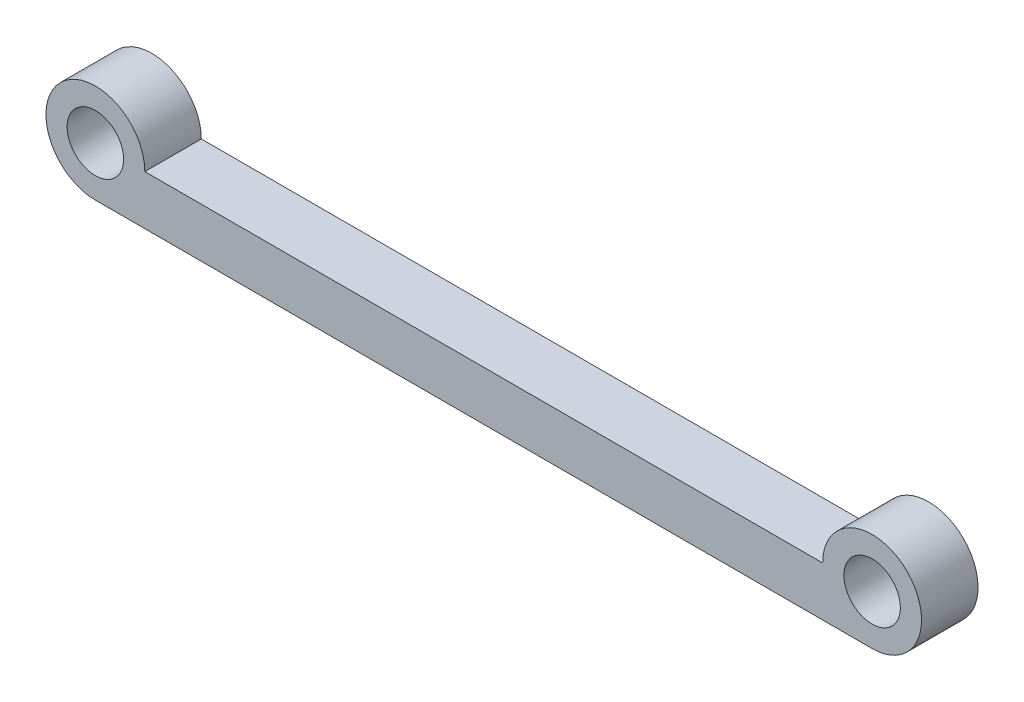
ISO-10303-21;
HEADER;
FILE_DESCRIPTION(('STEP AP214'),'2;1');
FILE_NAME('part.step','',(''),(''),'','','');
FILE_SCHEMA(('AUTOMOTIVE_DESIGN { 1 0 10303 214 1 1 1 1 }'));
ENDSEC;
DATA;
#1=APPLICATION_CONTEXT('core data for automotive mechanical design processes');
#2=APPLICATION_PROTOCOL_DEFINITION('international standard','automotive_design',2000,#1);
#3=PRODUCT_CONTEXT('',#1,'mechanical');
#4=PRODUCT('Part','Part','',(#3));
#5=PRODUCT_RELATED_PRODUCT_CATEGORY('part','',(#4));
#6=PRODUCT_DEFINITION_FORMATION('','',#4);
#7=PRODUCT_DEFINITION_CONTEXT('part definition',#1,'design');
#8=PRODUCT_DEFINITION('design','',#6,#7);
#9=PRODUCT_DEFINITION_SHAPE('','',#8);
#10=(LENGTH_UNIT() NAMED_UNIT(*) SI_UNIT(.MILLI.,.METRE.));
#11=(NAMED_UNIT(*) PLANE_ANGLE_UNIT() SI_UNIT($,.RADIAN.));
#12=(NAMED_UNIT(*) SI_UNIT($,.STERADIAN.) SOLID_ANGLE_UNIT());
#13=UNCERTAINTY_MEASURE_WITH_UNIT(LENGTH_MEASURE(1.E-05),#10,'distance_accuracy_value','');
#14=(GEOMETRIC_REPRESENTATION_CONTEXT(3) GLOBAL_UNCERTAINTY_ASSIGNED_CONTEXT((#13)) GLOBAL_UNIT_ASSIGNED_CONTEXT((#10,
#11,#12)) REPRESENTATION_CONTEXT('',''));
#15=CARTESIAN_POINT('',(0.,0.,0.));
#16=DIRECTION('',(0.,0.,1.));
#17=DIRECTION('',(1.,0.,0.));
#18=AXIS2_PLACEMENT_3D('',#15,#16,#17);
#19=CARTESIAN_POINT('',(0.,0.,4.));
#20=DIRECTION('',(0.,0.,1.));
#21=DIRECTION('',(1.,0.,0.));
#22=AXIS2_PLACEMENT_3D('',#19,#20,#21);
#23=PLANE('',#22);
#24=CARTESIAN_POINT('',(0.,0.,4.));
#25=DIRECTION('',(0.,0.,1.));
#26=DIRECTION('',(1.,0.,0.));
#27=AXIS2_PLACEMENT_3D('',#24,#25,#26);
#28=CIRCLE('',#27,2.);
#29=CARTESIAN_POINT('',(2.,0.,4.));
#30=VERTEX_POINT('',#29);
#31=EDGE_CURVE('E102',#30,#30,#28,.T.);
#32=ORIENTED_EDGE('',*,*,#31,.F.);
#33=EDGE_LOOP('',(#32));
#34=FACE_BOUND('',#33,.T.);
#35=CARTESIAN_POINT('',(0.,0.,4.));
#36=DIRECTION('',(0.,0.,1.));
#37=DIRECTION('',(1.,0.,0.));
#38=AXIS2_PLACEMENT_3D('',#35,#36,#37);
#39=CIRCLE('',#38,3.5);
#40=CARTESIAN_POINT('',(3.5,0.,4.));
#41=VERTEX_POINT('',#40);
#42=CARTESIAN_POINT('',(0.,-3.5,4.));
#43=VERTEX_POINT('',#42);
#44=EDGE_CURVE('E87',#41,#43,#39,.T.);
#45=ORIENTED_EDGE('',*,*,#44,.T.);
#46=DIRECTION('',(1.,0.,0.));
#47=VECTOR('',#46,1.);
#48=CARTESIAN_POINT('',(0.,-3.5,4.));
#49=LINE('',#48,#47);
#50=CARTESIAN_POINT('',(55.,-3.5,4.));
#51=VERTEX_POINT('',#50);
#52=EDGE_CURVE('E82',#43,#51,#49,.T.);
#53=ORIENTED_EDGE('',*,*,#52,.T.);
#54=CARTESIAN_POINT('',(55.,0.,4.));
#55=DIRECTION('',(0.,0.,1.));
#56=DIRECTION('',(1.,0.,0.));
#57=AXIS2_PLACEMENT_3D('',#54,#55,#56);
#58=CIRCLE('',#57,3.5);
#59=CARTESIAN_POINT('',(51.5,0.,4.));
#60=VERTEX_POINT('',#59);
#61=EDGE_CURVE('E85',#51,#60,#58,.T.);
#62=ORIENTED_EDGE('',*,*,#61,.T.);
#63=DIRECTION('',(-1.,0.,0.));
#64=VECTOR('',#63,1.);
#65=CARTESIAN_POINT('',(3.5,0.,4.));
#66=LINE('',#65,#64);
#67=EDGE_CURVE('E52',#60,#41,#66,.T.);
#68=ORIENTED_EDGE('',*,*,#67,.T.);
#69=EDGE_LOOP('',(#45,#53,#62,#68));
#70=FACE_BOUND('',#69,.T.);
#71=CARTESIAN_POINT('',(55.,0.,4.));
#72=DIRECTION('',(0.,0.,1.));
#73=DIRECTION('',(1.,0.,0.));
#74=AXIS2_PLACEMENT_3D('',#71,#72,#73);
#75=CIRCLE('',#74,2.);
#76=CARTESIAN_POINT('',(57.,0.,4.));
#77=VERTEX_POINT('',#76);
#78=EDGE_CURVE('E117',#77,#77,#75,.T.);
#79=ORIENTED_EDGE('',*,*,#78,.F.);
#80=EDGE_LOOP('',(#79));
#81=FACE_BOUND('',#80,.T.);
#82=ADVANCED_FACE('F35',(#34,#70,#81),#23,.T.);
#83=CARTESIAN_POINT('',(0.,0.,0.));
#84=DIRECTION('',(0.,0.,1.));
#85=DIRECTION('',(1.,0.,0.));
#86=AXIS2_PLACEMENT_3D('',#83,#84,#85);
#87=PLANE('',#86);
#88=CARTESIAN_POINT('',(0.,0.,0.));
#89=DIRECTION('',(0.,0.,1.));
#90=DIRECTION('',(1.,0.,0.));
#91=AXIS2_PLACEMENT_3D('',#88,#89,#90);
#92=CIRCLE('',#91,3.5);
#93=CARTESIAN_POINT('',(3.5,0.,0.));
#94=VERTEX_POINT('',#93);
#95=CARTESIAN_POINT('',(0.,-3.5,0.));
#96=VERTEX_POINT('',#95);
#97=EDGE_CURVE('E99',#94,#96,#92,.T.);
#98=ORIENTED_EDGE('',*,*,#97,.F.);
#99=DIRECTION('',(-1.,0.,0.));
#100=VECTOR('',#99,1.);
#101=CARTESIAN_POINT('',(3.5,0.,0.));
#102=LINE('',#101,#100);
#103=CARTESIAN_POINT('',(51.5,0.,0.));
#104=VERTEX_POINT('',#103);
#105=EDGE_CURVE('E75',#104,#94,#102,.T.);
#106=ORIENTED_EDGE('',*,*,#105,.F.);
#107=CARTESIAN_POINT('',(55.,0.,0.));
#108=DIRECTION('',(0.,0.,1.));
#109=DIRECTION('',(1.,0.,0.));
#110=AXIS2_PLACEMENT_3D('',#107,#108,#109);
#111=CIRCLE('',#110,3.5);
#112=CARTESIAN_POINT('',(55.,-3.5,0.));
#113=VERTEX_POINT('',#112);
#114=EDGE_CURVE('E69',#113,#104,#111,.T.);
#115=ORIENTED_EDGE('',*,*,#114,.F.);
#116=DIRECTION('',(1.,0.,0.));
#117=VECTOR('',#116,1.);
#118=CARTESIAN_POINT('',(0.,-3.5,0.));
#119=LINE('',#118,#117);
#120=EDGE_CURVE('E91',#96,#113,#119,.T.);
#121=ORIENTED_EDGE('',*,*,#120,.F.);
#122=EDGE_LOOP('',(#98,#106,#115,#121));
#123=FACE_BOUND('',#122,.T.);
#124=CARTESIAN_POINT('',(0.,0.,0.));
#125=DIRECTION('',(0.,0.,1.));
#126=DIRECTION('',(1.,0.,0.));
#127=AXIS2_PLACEMENT_3D('',#124,#125,#126);
#128=CIRCLE('',#127,2.);
#129=CARTESIAN_POINT('',(2.,0.,0.));
#130=VERTEX_POINT('',#129);
#131=EDGE_CURVE('E114',#130,#130,#128,.T.);
#132=ORIENTED_EDGE('',*,*,#131,.T.);
#133=EDGE_LOOP('',(#132));
#134=FACE_BOUND('',#133,.T.);
#135=CARTESIAN_POINT('',(55.,0.,0.));
#136=DIRECTION('',(0.,0.,1.));
#137=DIRECTION('',(1.,0.,0.));
#138=AXIS2_PLACEMENT_3D('',#135,#136,#137);
#139=CIRCLE('',#138,2.);
#140=CARTESIAN_POINT('',(57.,0.,0.));
#141=VERTEX_POINT('',#140);
#142=EDGE_CURVE('E120',#141,#141,#139,.T.);
#143=ORIENTED_EDGE('',*,*,#142,.T.);
#144=EDGE_LOOP('',(#143));
#145=FACE_BOUND('',#144,.T.);
#146=ADVANCED_FACE('F110',(#123,#134,#145),#87,.F.);
#147=CARTESIAN_POINT('',(0.,0.,4.));
#148=DIRECTION('',(0.,0.,-1.));
#149=DIRECTION('',(-1.,0.,0.));
#150=AXIS2_PLACEMENT_3D('',#147,#148,#149);
#151=CYLINDRICAL_SURFACE('',#150,3.5);
#152=ORIENTED_EDGE('',*,*,#97,.T.);
#153=DIRECTION('',(0.,0.,-1.));
#154=VECTOR('',#153,1.);
#155=CARTESIAN_POINT('',(0.,-3.5,4.));
#156=LINE('',#155,#154);
#157=EDGE_CURVE('E11',#43,#96,#156,.T.);
#158=ORIENTED_EDGE('',*,*,#157,.F.);
#159=ORIENTED_EDGE('',*,*,#44,.F.);
#160=DIRECTION('',(0.,0.,-1.));
#161=VECTOR('',#160,1.);
#162=CARTESIAN_POINT('',(3.5,0.,4.));
#163=LINE('',#162,#161);
#164=EDGE_CURVE('E95',#41,#94,#163,.T.);
#165=ORIENTED_EDGE('',*,*,#164,.T.);
#166=EDGE_LOOP('',(#152,#158,#159,#165));
#167=FACE_BOUND('',#166,.T.);
#168=ADVANCED_FACE('F37',(#167),#151,.T.);
#169=CARTESIAN_POINT('',(0.,-3.5,4.));
#170=DIRECTION('',(0.,1.,0.));
#171=DIRECTION('',(-1.,0.,0.));
#172=AXIS2_PLACEMENT_3D('',#169,#170,#171);
#173=PLANE('',#172);
#174=ORIENTED_EDGE('',*,*,#120,.T.);
#175=DIRECTION('',(0.,0.,-1.));
#176=VECTOR('',#175,1.);
#177=CARTESIAN_POINT('',(55.,-3.5,4.));
#178=LINE('',#177,#176);
#179=EDGE_CURVE('E44',#51,#113,#178,.T.);
#180=ORIENTED_EDGE('',*,*,#179,.F.);
#181=ORIENTED_EDGE('',*,*,#52,.F.);
#182=ORIENTED_EDGE('',*,*,#157,.T.);
#183=EDGE_LOOP('',(#174,#180,#181,#182));
#184=FACE_BOUND('',#183,.T.);
#185=ADVANCED_FACE('F90',(#184),#173,.F.);
#186=CARTESIAN_POINT('',(55.,0.,4.));
#187=DIRECTION('',(0.,0.,-1.));
#188=DIRECTION('',(-1.,0.,0.));
#189=AXIS2_PLACEMENT_3D('',#186,#187,#188);
#190=CYLINDRICAL_SURFACE('',#189,3.5);
#191=ORIENTED_EDGE('',*,*,#114,.T.);
#192=DIRECTION('',(0.,0.,-1.));
#193=VECTOR('',#192,1.);
#194=CARTESIAN_POINT('',(51.5,0.,4.));
#195=LINE('',#194,#193);
#196=EDGE_CURVE('E92',#60,#104,#195,.T.);
#197=ORIENTED_EDGE('',*,*,#196,.F.);
#198=ORIENTED_EDGE('',*,*,#61,.F.);
#199=ORIENTED_EDGE('',*,*,#179,.T.);
#200=EDGE_LOOP('',(#191,#197,#198,#199));
#201=FACE_BOUND('',#200,.T.);
#202=ADVANCED_FACE('F93',(#201),#190,.T.);
#203=CARTESIAN_POINT('',(3.5,0.,4.));
#204=DIRECTION('',(0.,-1.,0.));
#205=DIRECTION('',(0.,0.,-1.));
#206=AXIS2_PLACEMENT_3D('',#203,#204,#205);
#207=PLANE('',#206);
#208=ORIENTED_EDGE('',*,*,#105,.T.);
#209=ORIENTED_EDGE('',*,*,#164,.F.);
#210=ORIENTED_EDGE('',*,*,#67,.F.);
#211=ORIENTED_EDGE('',*,*,#196,.T.);
#212=EDGE_LOOP('',(#208,#209,#210,#211));
#213=FACE_BOUND('',#212,.T.);
#214=ADVANCED_FACE('F107',(#213),#207,.F.);
#215=CARTESIAN_POINT('',(0.,0.,4.));
#216=DIRECTION('',(0.,0.,-1.));
#217=DIRECTION('',(-1.,0.,0.));
#218=AXIS2_PLACEMENT_3D('',#215,#216,#217);
#219=CYLINDRICAL_SURFACE('',#218,2.);
#220=ORIENTED_EDGE('',*,*,#31,.T.);
#221=EDGE_LOOP('',(#220));
#222=FACE_BOUND('',#221,.T.);
#223=ORIENTED_EDGE('',*,*,#131,.F.);
#224=EDGE_LOOP('',(#223));
#225=FACE_BOUND('',#224,.T.);
#226=ADVANCED_FACE('F137',(#222,#225),#219,.F.);
#227=CARTESIAN_POINT('',(55.,0.,4.));
#228=DIRECTION('',(0.,0.,-1.));
#229=DIRECTION('',(-1.,0.,0.));
#230=AXIS2_PLACEMENT_3D('',#227,#228,#229);
#231=CYLINDRICAL_SURFACE('',#230,2.);
#232=ORIENTED_EDGE('',*,*,#78,.T.);
#233=EDGE_LOOP('',(#232));
#234=FACE_BOUND('',#233,.T.);
#235=ORIENTED_EDGE('',*,*,#142,.F.);
#236=EDGE_LOOP('',(#235));
#237=FACE_BOUND('',#236,.T.);
#238=ADVANCED_FACE('F126',(#234,#237),#231,.F.);
#239=CLOSED_SHELL('',(#82,#146,#168,#185,#202,#214,#226,#238));
#240=MANIFOLD_SOLID_BREP('B2',#239);
#241=ADVANCED_BREP_SHAPE_REPRESENTATION('',(#18,#240),#14);
#242=SHAPE_DEFINITION_REPRESENTATION(#9,#241);
ENDSEC;
END-ISO-10303-21;
